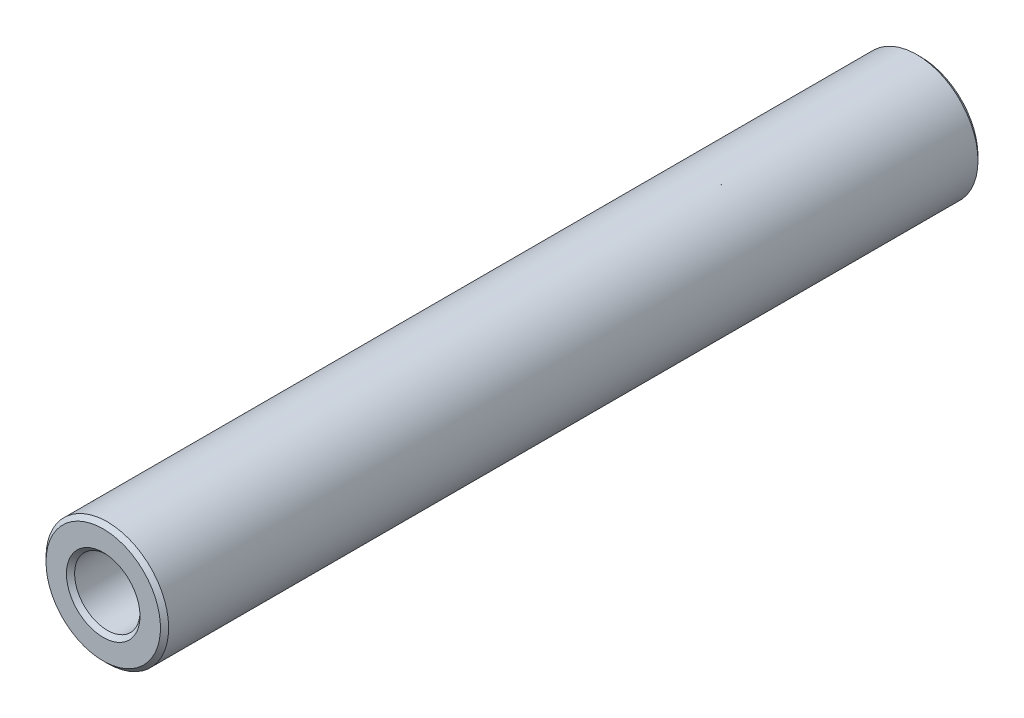
ISO-10303-21;
HEADER;
FILE_DESCRIPTION(('STEP AP214'),'2;1');
FILE_NAME('part.step','',(''),(''),'','','');
FILE_SCHEMA(('AUTOMOTIVE_DESIGN { 1 0 10303 214 1 1 1 1 }'));
ENDSEC;
DATA;
#1=APPLICATION_CONTEXT('core data for automotive mechanical design processes');
#2=APPLICATION_PROTOCOL_DEFINITION('international standard','automotive_design',2000,#1);
#3=PRODUCT_CONTEXT('',#1,'mechanical');
#4=PRODUCT('Part','Part','',(#3));
#5=PRODUCT_RELATED_PRODUCT_CATEGORY('part','',(#4));
#6=PRODUCT_DEFINITION_FORMATION('','',#4);
#7=PRODUCT_DEFINITION_CONTEXT('part definition',#1,'design');
#8=PRODUCT_DEFINITION('design','',#6,#7);
#9=PRODUCT_DEFINITION_SHAPE('','',#8);
#10=(LENGTH_UNIT() NAMED_UNIT(*) SI_UNIT(.MILLI.,.METRE.));
#11=(NAMED_UNIT(*) PLANE_ANGLE_UNIT() SI_UNIT($,.RADIAN.));
#12=(NAMED_UNIT(*) SI_UNIT($,.STERADIAN.) SOLID_ANGLE_UNIT());
#13=UNCERTAINTY_MEASURE_WITH_UNIT(LENGTH_MEASURE(1.E-05),#10,'distance_accuracy_value','');
#14=(GEOMETRIC_REPRESENTATION_CONTEXT(3) GLOBAL_UNCERTAINTY_ASSIGNED_CONTEXT((#13)) GLOBAL_UNIT_ASSIGNED_CONTEXT((#10,
#11,#12)) REPRESENTATION_CONTEXT('',''));
#15=CARTESIAN_POINT('',(0.,0.,0.));
#16=DIRECTION('',(0.,0.,1.));
#17=DIRECTION('',(1.,0.,0.));
#18=AXIS2_PLACEMENT_3D('',#15,#16,#17);
#19=CARTESIAN_POINT('',(0.,3.,20.));
#20=DIRECTION('',(0.,0.,-1.));
#21=DIRECTION('',(-1.,0.,0.));
#22=AXIS2_PLACEMENT_3D('',#19,#20,#21);
#23=PLANE('',#22);
#24=CARTESIAN_POINT('',(0.,0.,20.));
#25=DIRECTION('',(0.,0.,-1.));
#26=DIRECTION('',(-1.,0.,0.));
#27=AXIS2_PLACEMENT_3D('',#24,#25,#26);
#28=CIRCLE('',#27,1.8);
#29=CARTESIAN_POINT('',(-1.8,0.,20.));
#30=VERTEX_POINT('',#29);
#31=EDGE_CURVE('E68',#30,#30,#28,.T.);
#32=ORIENTED_EDGE('',*,*,#31,.T.);
#33=EDGE_LOOP('',(#32));
#34=FACE_BOUND('',#33,.T.);
#35=CARTESIAN_POINT('',(0.,0.,20.));
#36=DIRECTION('',(0.,0.,-1.));
#37=DIRECTION('',(-1.,0.,0.));
#38=AXIS2_PLACEMENT_3D('',#35,#36,#37);
#39=CIRCLE('',#38,2.79999999999999);
#40=CARTESIAN_POINT('',(-2.79999999999999,0.,20.));
#41=VERTEX_POINT('',#40);
#42=EDGE_CURVE('E72',#41,#41,#39,.F.);
#43=ORIENTED_EDGE('',*,*,#42,.T.);
#44=EDGE_LOOP('',(#43));
#45=FACE_BOUND('',#44,.T.);
#46=ADVANCED_FACE('F43',(#34,#45),#23,.F.);
#47=CARTESIAN_POINT('',(0.,0.,7.12809917355371));
#48=DIRECTION('',(0.,0.,1.));
#49=DIRECTION('',(1.,0.,0.));
#50=AXIS2_PLACEMENT_3D('',#47,#48,#49);
#51=CYLINDRICAL_SURFACE('',#50,1.6);
#52=CARTESIAN_POINT('',(0.,0.,19.8));
#53=DIRECTION('',(0.,0.,-1.));
#54=DIRECTION('',(-1.,0.,0.));
#55=AXIS2_PLACEMENT_3D('',#52,#53,#54);
#56=CIRCLE('',#55,1.6);
#57=CARTESIAN_POINT('',(-1.6,0.,19.8));
#58=VERTEX_POINT('',#57);
#59=EDGE_CURVE('E76',#58,#58,#56,.F.);
#60=ORIENTED_EDGE('',*,*,#59,.T.);
#61=EDGE_LOOP('',(#60));
#62=FACE_BOUND('',#61,.T.);
#63=CARTESIAN_POINT('',(0.,0.,-19.8));
#64=DIRECTION('',(0.,0.,1.));
#65=DIRECTION('',(1.,0.,0.));
#66=AXIS2_PLACEMENT_3D('',#63,#64,#65);
#67=CIRCLE('',#66,1.6);
#68=CARTESIAN_POINT('',(1.6,0.,-19.8));
#69=VERTEX_POINT('',#68);
#70=EDGE_CURVE('E80',#69,#69,#67,.F.);
#71=ORIENTED_EDGE('',*,*,#70,.T.);
#72=EDGE_LOOP('',(#71));
#73=FACE_BOUND('',#72,.T.);
#74=ADVANCED_FACE('F85',(#62,#73),#51,.F.);
#75=CARTESIAN_POINT('',(0.,3.,-20.));
#76=DIRECTION('',(0.,0.,1.));
#77=DIRECTION('',(1.,0.,0.));
#78=AXIS2_PLACEMENT_3D('',#75,#76,#77);
#79=PLANE('',#78);
#80=CARTESIAN_POINT('',(0.,0.,-20.));
#81=DIRECTION('',(0.,0.,1.));
#82=DIRECTION('',(1.,0.,0.));
#83=AXIS2_PLACEMENT_3D('',#80,#81,#82);
#84=CIRCLE('',#83,1.80000000000001);
#85=CARTESIAN_POINT('',(1.80000000000001,0.,-20.));
#86=VERTEX_POINT('',#85);
#87=EDGE_CURVE('E57',#86,#86,#84,.T.);
#88=ORIENTED_EDGE('',*,*,#87,.T.);
#89=EDGE_LOOP('',(#88));
#90=FACE_BOUND('',#89,.T.);
#91=CARTESIAN_POINT('',(0.,0.,-20.));
#92=DIRECTION('',(0.,0.,1.));
#93=DIRECTION('',(1.,0.,0.));
#94=AXIS2_PLACEMENT_3D('',#91,#92,#93);
#95=CIRCLE('',#94,2.79999999999999);
#96=CARTESIAN_POINT('',(2.79999999999999,0.,-20.));
#97=VERTEX_POINT('',#96);
#98=EDGE_CURVE('E62',#97,#97,#95,.F.);
#99=ORIENTED_EDGE('',*,*,#98,.T.);
#100=EDGE_LOOP('',(#99));
#101=FACE_BOUND('',#100,.T.);
#102=ADVANCED_FACE('F95',(#90,#101),#79,.F.);
#103=CARTESIAN_POINT('',(0.,0.,7.12809917355371));
#104=DIRECTION('',(0.,0.,1.));
#105=DIRECTION('',(1.,0.,0.));
#106=AXIS2_PLACEMENT_3D('',#103,#104,#105);
#107=CYLINDRICAL_SURFACE('',#106,3.);
#108=CARTESIAN_POINT('',(0.,0.,-19.8));
#109=DIRECTION('',(0.,0.,1.));
#110=DIRECTION('',(1.,0.,0.));
#111=AXIS2_PLACEMENT_3D('',#108,#109,#110);
#112=CIRCLE('',#111,3.);
#113=CARTESIAN_POINT('',(3.,0.,-19.8));
#114=VERTEX_POINT('',#113);
#115=EDGE_CURVE('E10',#114,#114,#112,.T.);
#116=ORIENTED_EDGE('',*,*,#115,.T.);
#117=EDGE_LOOP('',(#116));
#118=FACE_BOUND('',#117,.T.);
#119=CARTESIAN_POINT('',(0.,0.,19.8));
#120=DIRECTION('',(0.,0.,-1.));
#121=DIRECTION('',(-1.,0.,0.));
#122=AXIS2_PLACEMENT_3D('',#119,#120,#121);
#123=CIRCLE('',#122,3.);
#124=CARTESIAN_POINT('',(-3.,0.,19.8));
#125=VERTEX_POINT('',#124);
#126=EDGE_CURVE('E52',#125,#125,#123,.T.);
#127=ORIENTED_EDGE('',*,*,#126,.T.);
#128=EDGE_LOOP('',(#127));
#129=FACE_BOUND('',#128,.T.);
#130=ADVANCED_FACE('F98',(#118,#129),#107,.T.);
#131=CARTESIAN_POINT('',(0.,0.,19.8));
#132=DIRECTION('',(0.,0.,1.));
#133=DIRECTION('',(1.,0.,0.));
#134=AXIS2_PLACEMENT_3D('',#131,#132,#133);
#135=CONICAL_SURFACE('',#134,1.6,0.785398163397443);
#136=ORIENTED_EDGE('',*,*,#31,.F.);
#137=EDGE_LOOP('',(#136));
#138=FACE_BOUND('',#137,.T.);
#139=ORIENTED_EDGE('',*,*,#59,.F.);
#140=EDGE_LOOP('',(#139));
#141=FACE_BOUND('',#140,.T.);
#142=ADVANCED_FACE('F91',(#138,#141),#135,.F.);
#143=CARTESIAN_POINT('',(0.,0.,-20.));
#144=DIRECTION('',(0.,0.,-1.));
#145=DIRECTION('',(-1.,0.,0.));
#146=AXIS2_PLACEMENT_3D('',#143,#144,#145);
#147=CONICAL_SURFACE('',#146,1.80000000000001,0.785398163397453);
#148=ORIENTED_EDGE('',*,*,#70,.F.);
#149=EDGE_LOOP('',(#148));
#150=FACE_BOUND('',#149,.T.);
#151=ORIENTED_EDGE('',*,*,#87,.F.);
#152=EDGE_LOOP('',(#151));
#153=FACE_BOUND('',#152,.T.);
#154=ADVANCED_FACE('F87',(#150,#153),#147,.F.);
#155=CARTESIAN_POINT('',(0.,0.,-19.8));
#156=DIRECTION('',(0.,0.,1.));
#157=DIRECTION('',(1.,0.,0.));
#158=AXIS2_PLACEMENT_3D('',#155,#156,#157);
#159=CONICAL_SURFACE('',#158,3.,0.785398163397448);
#160=ORIENTED_EDGE('',*,*,#98,.F.);
#161=EDGE_LOOP('',(#160));
#162=FACE_BOUND('',#161,.T.);
#163=ORIENTED_EDGE('',*,*,#115,.F.);
#164=EDGE_LOOP('',(#163));
#165=FACE_BOUND('',#164,.T.);
#166=ADVANCED_FACE('F90',(#162,#165),#159,.T.);
#167=CARTESIAN_POINT('',(0.,0.,20.));
#168=DIRECTION('',(0.,0.,-1.));
#169=DIRECTION('',(-1.,0.,0.));
#170=AXIS2_PLACEMENT_3D('',#167,#168,#169);
#171=CONICAL_SURFACE('',#170,2.79999999999999,0.785398163397456);
#172=ORIENTED_EDGE('',*,*,#126,.F.);
#173=EDGE_LOOP('',(#172));
#174=FACE_BOUND('',#173,.T.);
#175=ORIENTED_EDGE('',*,*,#42,.F.);
#176=EDGE_LOOP('',(#175));
#177=FACE_BOUND('',#176,.T.);
#178=ADVANCED_FACE('F46',(#174,#177),#171,.T.);
#179=CLOSED_SHELL('',(#46,#74,#102,#130,#142,#154,#166,#178));
#180=MANIFOLD_SOLID_BREP('B2',#179);
#181=ADVANCED_BREP_SHAPE_REPRESENTATION('',(#18,#180),#14);
#182=SHAPE_DEFINITION_REPRESENTATION(#9,#181);
ENDSEC;
END-ISO-10303-21;
